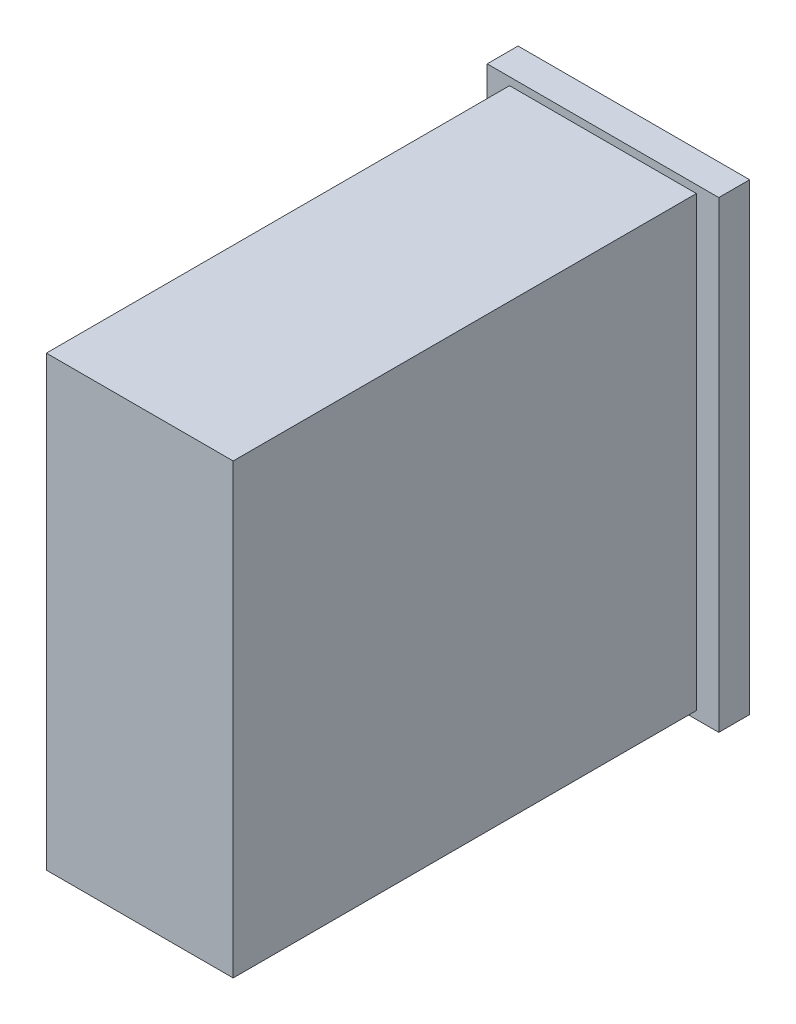
ISO-10303-21;
HEADER;
FILE_DESCRIPTION(('STEP AP214'),'2;1');
FILE_NAME('part.step','',(''),(''),'','','');
FILE_SCHEMA(('AUTOMOTIVE_DESIGN { 1 0 10303 214 1 1 1 1 }'));
ENDSEC;
DATA;
#1=APPLICATION_CONTEXT('core data for automotive mechanical design processes');
#2=APPLICATION_PROTOCOL_DEFINITION('international standard','automotive_design',2000,#1);
#3=PRODUCT_CONTEXT('',#1,'mechanical');
#4=PRODUCT('Part','Part','',(#3));
#5=PRODUCT_RELATED_PRODUCT_CATEGORY('part','',(#4));
#6=PRODUCT_DEFINITION_FORMATION('','',#4);
#7=PRODUCT_DEFINITION_CONTEXT('part definition',#1,'design');
#8=PRODUCT_DEFINITION('design','',#6,#7);
#9=PRODUCT_DEFINITION_SHAPE('','',#8);
#10=(LENGTH_UNIT() NAMED_UNIT(*) SI_UNIT(.MILLI.,.METRE.));
#11=(NAMED_UNIT(*) PLANE_ANGLE_UNIT() SI_UNIT($,.RADIAN.));
#12=(NAMED_UNIT(*) SI_UNIT($,.STERADIAN.) SOLID_ANGLE_UNIT());
#13=UNCERTAINTY_MEASURE_WITH_UNIT(LENGTH_MEASURE(1.E-05),#10,'distance_accuracy_value','');
#14=(GEOMETRIC_REPRESENTATION_CONTEXT(3) GLOBAL_UNCERTAINTY_ASSIGNED_CONTEXT((#13)) GLOBAL_UNIT_ASSIGNED_CONTEXT((#10,
#11,#12)) REPRESENTATION_CONTEXT('',''));
#15=CARTESIAN_POINT('',(0.,0.,0.));
#16=DIRECTION('',(0.,0.,1.));
#17=DIRECTION('',(1.,0.,0.));
#18=AXIS2_PLACEMENT_3D('',#15,#16,#17);
#19=CARTESIAN_POINT('',(7.5,15.,2.));
#20=DIRECTION('',(-1.,0.,0.));
#21=DIRECTION('',(0.,-1.,0.));
#22=AXIS2_PLACEMENT_3D('',#19,#20,#21);
#23=PLANE('',#22);
#24=DIRECTION('',(0.,1.,0.));
#25=VECTOR('',#24,1.);
#26=CARTESIAN_POINT('',(7.5,15.,0.));
#27=LINE('',#26,#25);
#28=CARTESIAN_POINT('',(7.5,-15.,0.));
#29=VERTEX_POINT('',#28);
#30=CARTESIAN_POINT('',(7.5,15.,0.));
#31=VERTEX_POINT('',#30);
#32=EDGE_CURVE('E123',#29,#31,#27,.T.);
#33=ORIENTED_EDGE('',*,*,#32,.T.);
#34=DIRECTION('',(0.,0.,-1.));
#35=VECTOR('',#34,1.);
#36=CARTESIAN_POINT('',(7.5,15.,2.));
#37=LINE('',#36,#35);
#38=CARTESIAN_POINT('',(7.5,15.,2.));
#39=VERTEX_POINT('',#38);
#40=EDGE_CURVE('E11',#39,#31,#37,.T.);
#41=ORIENTED_EDGE('',*,*,#40,.F.);
#42=DIRECTION('',(0.,1.,0.));
#43=VECTOR('',#42,1.);
#44=CARTESIAN_POINT('',(7.5,15.,2.));
#45=LINE('',#44,#43);
#46=CARTESIAN_POINT('',(7.5,-15.,2.));
#47=VERTEX_POINT('',#46);
#48=EDGE_CURVE('E132',#47,#39,#45,.T.);
#49=ORIENTED_EDGE('',*,*,#48,.F.);
#50=DIRECTION('',(0.,0.,-1.));
#51=VECTOR('',#50,1.);
#52=CARTESIAN_POINT('',(7.5,-15.,2.));
#53=LINE('',#52,#51);
#54=EDGE_CURVE('E141',#47,#29,#53,.T.);
#55=ORIENTED_EDGE('',*,*,#54,.T.);
#56=EDGE_LOOP('',(#33,#41,#49,#55));
#57=FACE_BOUND('',#56,.T.);
#58=ADVANCED_FACE('F39',(#57),#23,.F.);
#59=CARTESIAN_POINT('',(-7.5,15.,2.));
#60=DIRECTION('',(0.,-1.,0.));
#61=DIRECTION('',(0.,0.,-1.));
#62=AXIS2_PLACEMENT_3D('',#59,#60,#61);
#63=PLANE('',#62);
#64=DIRECTION('',(-1.,0.,0.));
#65=VECTOR('',#64,1.);
#66=CARTESIAN_POINT('',(-7.5,15.,0.));
#67=LINE('',#66,#65);
#68=CARTESIAN_POINT('',(-7.5,15.,0.));
#69=VERTEX_POINT('',#68);
#70=EDGE_CURVE('E126',#31,#69,#67,.T.);
#71=ORIENTED_EDGE('',*,*,#70,.T.);
#72=DIRECTION('',(0.,0.,-1.));
#73=VECTOR('',#72,1.);
#74=CARTESIAN_POINT('',(-7.5,15.,2.));
#75=LINE('',#74,#73);
#76=CARTESIAN_POINT('',(-7.5,15.,2.));
#77=VERTEX_POINT('',#76);
#78=EDGE_CURVE('E46',#77,#69,#75,.T.);
#79=ORIENTED_EDGE('',*,*,#78,.F.);
#80=DIRECTION('',(-1.,0.,0.));
#81=VECTOR('',#80,1.);
#82=CARTESIAN_POINT('',(-7.5,15.,2.));
#83=LINE('',#82,#81);
#84=EDGE_CURVE('E135',#39,#77,#83,.T.);
#85=ORIENTED_EDGE('',*,*,#84,.F.);
#86=ORIENTED_EDGE('',*,*,#40,.T.);
#87=EDGE_LOOP('',(#71,#79,#85,#86));
#88=FACE_BOUND('',#87,.T.);
#89=ADVANCED_FACE('F172',(#88),#63,.F.);
#90=CARTESIAN_POINT('',(-7.5,15.,2.));
#91=DIRECTION('',(1.,0.,0.));
#92=DIRECTION('',(0.,1.,0.));
#93=AXIS2_PLACEMENT_3D('',#90,#91,#92);
#94=PLANE('',#93);
#95=DIRECTION('',(0.,-1.,0.));
#96=VECTOR('',#95,1.);
#97=CARTESIAN_POINT('',(-7.5,15.,0.));
#98=LINE('',#97,#96);
#99=CARTESIAN_POINT('',(-7.5,-15.,0.));
#100=VERTEX_POINT('',#99);
#101=EDGE_CURVE('E144',#69,#100,#98,.T.);
#102=ORIENTED_EDGE('',*,*,#101,.T.);
#103=DIRECTION('',(0.,0.,-1.));
#104=VECTOR('',#103,1.);
#105=CARTESIAN_POINT('',(-7.5,-15.,2.));
#106=LINE('',#105,#104);
#107=CARTESIAN_POINT('',(-7.5,-15.,2.));
#108=VERTEX_POINT('',#107);
#109=EDGE_CURVE('E149',#108,#100,#106,.T.);
#110=ORIENTED_EDGE('',*,*,#109,.F.);
#111=DIRECTION('',(0.,-1.,0.));
#112=VECTOR('',#111,1.);
#113=CARTESIAN_POINT('',(-7.5,15.,2.));
#114=LINE('',#113,#112);
#115=EDGE_CURVE('E138',#77,#108,#114,.T.);
#116=ORIENTED_EDGE('',*,*,#115,.F.);
#117=ORIENTED_EDGE('',*,*,#78,.T.);
#118=EDGE_LOOP('',(#102,#110,#116,#117));
#119=FACE_BOUND('',#118,.T.);
#120=ADVANCED_FACE('F156',(#119),#94,.F.);
#121=CARTESIAN_POINT('',(-7.5,-15.,2.));
#122=DIRECTION('',(0.,1.,0.));
#123=DIRECTION('',(0.,0.,1.));
#124=AXIS2_PLACEMENT_3D('',#121,#122,#123);
#125=PLANE('',#124);
#126=DIRECTION('',(1.,0.,0.));
#127=VECTOR('',#126,1.);
#128=CARTESIAN_POINT('',(-7.5,-15.,0.));
#129=LINE('',#128,#127);
#130=EDGE_CURVE('E136',#100,#29,#129,.T.);
#131=ORIENTED_EDGE('',*,*,#130,.T.);
#132=ORIENTED_EDGE('',*,*,#54,.F.);
#133=DIRECTION('',(1.,0.,0.));
#134=VECTOR('',#133,1.);
#135=CARTESIAN_POINT('',(-7.5,-15.,2.));
#136=LINE('',#135,#134);
#137=EDGE_CURVE('E140',#108,#47,#136,.T.);
#138=ORIENTED_EDGE('',*,*,#137,.F.);
#139=ORIENTED_EDGE('',*,*,#109,.T.);
#140=EDGE_LOOP('',(#131,#132,#138,#139));
#141=FACE_BOUND('',#140,.T.);
#142=ADVANCED_FACE('F165',(#141),#125,.F.);
#143=CARTESIAN_POINT('',(0.,0.,2.));
#144=DIRECTION('',(0.,0.,1.));
#145=DIRECTION('',(1.,0.,0.));
#146=AXIS2_PLACEMENT_3D('',#143,#144,#145);
#147=PLANE('',#146);
#148=DIRECTION('',(0.,1.,0.));
#149=VECTOR('',#148,1.);
#150=CARTESIAN_POINT('',(6.05,14.5,2.));
#151=LINE('',#150,#149);
#152=CARTESIAN_POINT('',(6.05,-14.5,2.));
#153=VERTEX_POINT('',#152);
#154=CARTESIAN_POINT('',(6.05,14.5,2.));
#155=VERTEX_POINT('',#154);
#156=EDGE_CURVE('E53',#153,#155,#151,.T.);
#157=ORIENTED_EDGE('',*,*,#156,.F.);
#158=DIRECTION('',(1.,0.,0.));
#159=VECTOR('',#158,1.);
#160=CARTESIAN_POINT('',(-6.05,-14.5,2.));
#161=LINE('',#160,#159);
#162=CARTESIAN_POINT('',(-6.05,-14.5,2.));
#163=VERTEX_POINT('',#162);
#164=EDGE_CURVE('E57',#163,#153,#161,.T.);
#165=ORIENTED_EDGE('',*,*,#164,.F.);
#166=DIRECTION('',(0.,-1.,0.));
#167=VECTOR('',#166,1.);
#168=CARTESIAN_POINT('',(-6.05,14.5,2.));
#169=LINE('',#168,#167);
#170=CARTESIAN_POINT('',(-6.05,14.5,2.));
#171=VERTEX_POINT('',#170);
#172=EDGE_CURVE('E266',#171,#163,#169,.T.);
#173=ORIENTED_EDGE('',*,*,#172,.F.);
#174=DIRECTION('',(-1.,0.,0.));
#175=VECTOR('',#174,1.);
#176=CARTESIAN_POINT('',(-6.05,14.5,2.));
#177=LINE('',#176,#175);
#178=EDGE_CURVE('E272',#155,#171,#177,.T.);
#179=ORIENTED_EDGE('',*,*,#178,.F.);
#180=EDGE_LOOP('',(#157,#165,#173,#179));
#181=FACE_BOUND('',#180,.T.);
#182=ORIENTED_EDGE('',*,*,#48,.T.);
#183=ORIENTED_EDGE('',*,*,#84,.T.);
#184=ORIENTED_EDGE('',*,*,#115,.T.);
#185=ORIENTED_EDGE('',*,*,#137,.T.);
#186=EDGE_LOOP('',(#182,#183,#184,#185));
#187=FACE_BOUND('',#186,.T.);
#188=ADVANCED_FACE('F171',(#181,#187),#147,.T.);
#189=CARTESIAN_POINT('',(0.,0.,0.));
#190=DIRECTION('',(0.,0.,1.));
#191=DIRECTION('',(1.,0.,0.));
#192=AXIS2_PLACEMENT_3D('',#189,#190,#191);
#193=PLANE('',#192);
#194=ORIENTED_EDGE('',*,*,#32,.F.);
#195=ORIENTED_EDGE('',*,*,#130,.F.);
#196=ORIENTED_EDGE('',*,*,#101,.F.);
#197=ORIENTED_EDGE('',*,*,#70,.F.);
#198=EDGE_LOOP('',(#194,#195,#196,#197));
#199=FACE_BOUND('',#198,.T.);
#200=ADVANCED_FACE('F162',(#199),#193,.F.);
#201=CARTESIAN_POINT('',(6.05,14.5,32.));
#202=DIRECTION('',(-1.,0.,0.));
#203=DIRECTION('',(0.,-1.,0.));
#204=AXIS2_PLACEMENT_3D('',#201,#202,#203);
#205=PLANE('',#204);
#206=ORIENTED_EDGE('',*,*,#156,.T.);
#207=DIRECTION('',(0.,0.,-1.));
#208=VECTOR('',#207,1.);
#209=CARTESIAN_POINT('',(6.05,14.5,32.));
#210=LINE('',#209,#208);
#211=CARTESIAN_POINT('',(6.05,14.5,32.));
#212=VERTEX_POINT('',#211);
#213=EDGE_CURVE('E106',#212,#155,#210,.T.);
#214=ORIENTED_EDGE('',*,*,#213,.F.);
#215=DIRECTION('',(0.,1.,0.));
#216=VECTOR('',#215,1.);
#217=CARTESIAN_POINT('',(6.05,14.5,32.));
#218=LINE('',#217,#216);
#219=CARTESIAN_POINT('',(6.05,-14.5,32.));
#220=VERTEX_POINT('',#219);
#221=EDGE_CURVE('E112',#220,#212,#218,.T.);
#222=ORIENTED_EDGE('',*,*,#221,.F.);
#223=DIRECTION('',(0.,0.,-1.));
#224=VECTOR('',#223,1.);
#225=CARTESIAN_POINT('',(6.05,-14.5,32.));
#226=LINE('',#225,#224);
#227=EDGE_CURVE('E264',#220,#153,#226,.T.);
#228=ORIENTED_EDGE('',*,*,#227,.T.);
#229=EDGE_LOOP('',(#206,#214,#222,#228));
#230=FACE_BOUND('',#229,.T.);
#231=ADVANCED_FACE('F122',(#230),#205,.F.);
#232=CARTESIAN_POINT('',(-6.05,14.5,32.));
#233=DIRECTION('',(0.,-1.,0.));
#234=DIRECTION('',(0.,0.,-1.));
#235=AXIS2_PLACEMENT_3D('',#232,#233,#234);
#236=PLANE('',#235);
#237=ORIENTED_EDGE('',*,*,#178,.T.);
#238=DIRECTION('',(0.,0.,-1.));
#239=VECTOR('',#238,1.);
#240=CARTESIAN_POINT('',(-6.05,14.5,32.));
#241=LINE('',#240,#239);
#242=CARTESIAN_POINT('',(-6.05,14.5,32.));
#243=VERTEX_POINT('',#242);
#244=EDGE_CURVE('E108',#243,#171,#241,.T.);
#245=ORIENTED_EDGE('',*,*,#244,.F.);
#246=DIRECTION('',(-1.,0.,0.));
#247=VECTOR('',#246,1.);
#248=CARTESIAN_POINT('',(-6.05,14.5,32.));
#249=LINE('',#248,#247);
#250=EDGE_CURVE('E101',#212,#243,#249,.T.);
#251=ORIENTED_EDGE('',*,*,#250,.F.);
#252=ORIENTED_EDGE('',*,*,#213,.T.);
#253=EDGE_LOOP('',(#237,#245,#251,#252));
#254=FACE_BOUND('',#253,.T.);
#255=ADVANCED_FACE('F104',(#254),#236,.F.);
#256=CARTESIAN_POINT('',(-6.05,14.5,32.));
#257=DIRECTION('',(1.,0.,0.));
#258=DIRECTION('',(0.,1.,0.));
#259=AXIS2_PLACEMENT_3D('',#256,#257,#258);
#260=PLANE('',#259);
#261=ORIENTED_EDGE('',*,*,#172,.T.);
#262=DIRECTION('',(0.,0.,-1.));
#263=VECTOR('',#262,1.);
#264=CARTESIAN_POINT('',(-6.05,-14.5,32.));
#265=LINE('',#264,#263);
#266=CARTESIAN_POINT('',(-6.05,-14.5,32.));
#267=VERTEX_POINT('',#266);
#268=EDGE_CURVE('E128',#267,#163,#265,.T.);
#269=ORIENTED_EDGE('',*,*,#268,.F.);
#270=DIRECTION('',(0.,-1.,0.));
#271=VECTOR('',#270,1.);
#272=CARTESIAN_POINT('',(-6.05,14.5,32.));
#273=LINE('',#272,#271);
#274=EDGE_CURVE('E111',#243,#267,#273,.T.);
#275=ORIENTED_EDGE('',*,*,#274,.F.);
#276=ORIENTED_EDGE('',*,*,#244,.T.);
#277=EDGE_LOOP('',(#261,#269,#275,#276));
#278=FACE_BOUND('',#277,.T.);
#279=ADVANCED_FACE('F190',(#278),#260,.F.);
#280=CARTESIAN_POINT('',(-6.05,-14.5,32.));
#281=DIRECTION('',(0.,1.,0.));
#282=DIRECTION('',(0.,0.,1.));
#283=AXIS2_PLACEMENT_3D('',#280,#281,#282);
#284=PLANE('',#283);
#285=ORIENTED_EDGE('',*,*,#164,.T.);
#286=ORIENTED_EDGE('',*,*,#227,.F.);
#287=DIRECTION('',(1.,0.,0.));
#288=VECTOR('',#287,1.);
#289=CARTESIAN_POINT('',(-6.05,-14.5,32.));
#290=LINE('',#289,#288);
#291=EDGE_CURVE('E117',#267,#220,#290,.T.);
#292=ORIENTED_EDGE('',*,*,#291,.F.);
#293=ORIENTED_EDGE('',*,*,#268,.T.);
#294=EDGE_LOOP('',(#285,#286,#292,#293));
#295=FACE_BOUND('',#294,.T.);
#296=ADVANCED_FACE('F193',(#295),#284,.F.);
#297=CARTESIAN_POINT('',(0.,0.,32.));
#298=DIRECTION('',(0.,0.,1.));
#299=DIRECTION('',(1.,0.,0.));
#300=AXIS2_PLACEMENT_3D('',#297,#298,#299);
#301=PLANE('',#300);
#302=ORIENTED_EDGE('',*,*,#221,.T.);
#303=ORIENTED_EDGE('',*,*,#250,.T.);
#304=ORIENTED_EDGE('',*,*,#274,.T.);
#305=ORIENTED_EDGE('',*,*,#291,.T.);
#306=EDGE_LOOP('',(#302,#303,#304,#305));
#307=FACE_BOUND('',#306,.T.);
#308=ADVANCED_FACE('F115',(#307),#301,.T.);
#309=CLOSED_SHELL('',(#58,#89,#120,#142,#188,#200,#231,#255,#279,#296,#308));
#310=MANIFOLD_SOLID_BREP('B2',#309);
#311=ADVANCED_BREP_SHAPE_REPRESENTATION('',(#18,#310),#14);
#312=SHAPE_DEFINITION_REPRESENTATION(#9,#311);
ENDSEC;
END-ISO-10303-21;
